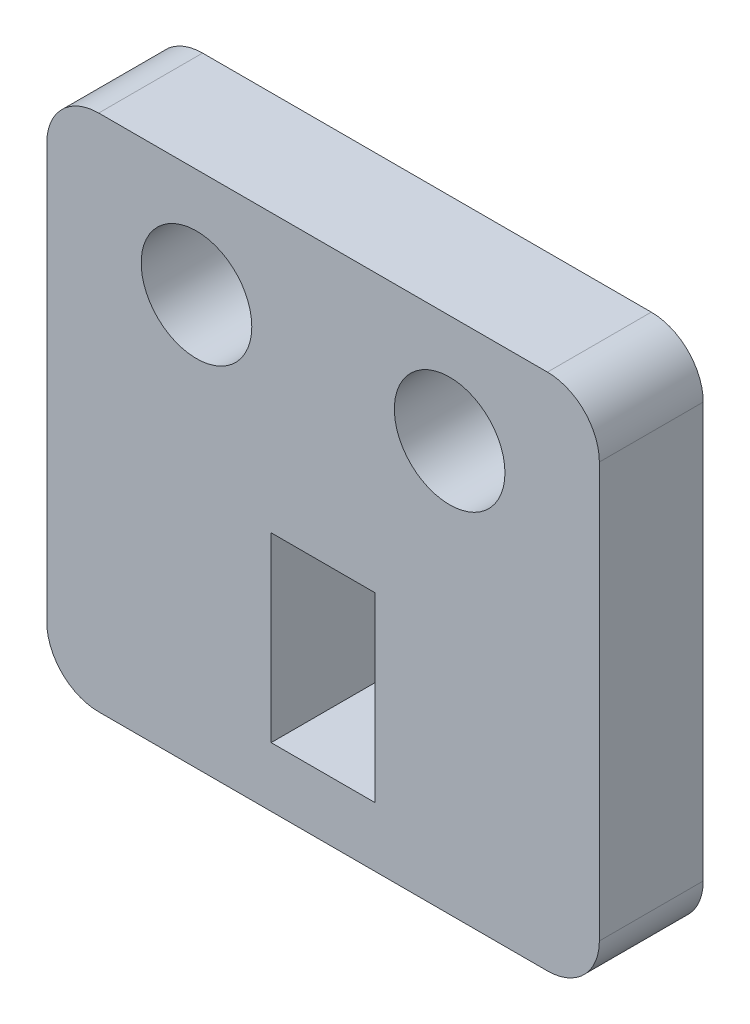
ISO-10303-21;
HEADER;
FILE_DESCRIPTION(('STEP AP214'),'2;1');
FILE_NAME('part.step','',(''),(''),'','','');
FILE_SCHEMA(('AUTOMOTIVE_DESIGN { 1 0 10303 214 1 1 1 1 }'));
ENDSEC;
DATA;
#1=APPLICATION_CONTEXT('core data for automotive mechanical design processes');
#2=APPLICATION_PROTOCOL_DEFINITION('international standard','automotive_design',2000,#1);
#3=PRODUCT_CONTEXT('',#1,'mechanical');
#4=PRODUCT('Part','Part','',(#3));
#5=PRODUCT_RELATED_PRODUCT_CATEGORY('part','',(#4));
#6=PRODUCT_DEFINITION_FORMATION('','',#4);
#7=PRODUCT_DEFINITION_CONTEXT('part definition',#1,'design');
#8=PRODUCT_DEFINITION('design','',#6,#7);
#9=PRODUCT_DEFINITION_SHAPE('','',#8);
#10=(LENGTH_UNIT() NAMED_UNIT(*) SI_UNIT(.MILLI.,.METRE.));
#11=(NAMED_UNIT(*) PLANE_ANGLE_UNIT() SI_UNIT($,.RADIAN.));
#12=(NAMED_UNIT(*) SI_UNIT($,.STERADIAN.) SOLID_ANGLE_UNIT());
#13=UNCERTAINTY_MEASURE_WITH_UNIT(LENGTH_MEASURE(1.E-05),#10,'distance_accuracy_value','');
#14=(GEOMETRIC_REPRESENTATION_CONTEXT(3) GLOBAL_UNCERTAINTY_ASSIGNED_CONTEXT((#13)) GLOBAL_UNIT_ASSIGNED_CONTEXT((#10,
#11,#12)) REPRESENTATION_CONTEXT('',''));
#15=CARTESIAN_POINT('',(0.,0.,0.));
#16=DIRECTION('',(0.,0.,1.));
#17=DIRECTION('',(1.,0.,0.));
#18=AXIS2_PLACEMENT_3D('',#15,#16,#17);
#19=CARTESIAN_POINT('',(0.,0.,4.));
#20=DIRECTION('',(0.,0.,-1.));
#21=DIRECTION('',(-1.,0.,0.));
#22=AXIS2_PLACEMENT_3D('',#19,#20,#21);
#23=PLANE('',#22);
#24=CARTESIAN_POINT('',(15.5159999244613,15.7941228703285,4.));
#25=DIRECTION('',(0.,0.,1.));
#26=DIRECTION('',(1.,0.,0.));
#27=AXIS2_PLACEMENT_3D('',#24,#25,#26);
#28=CIRCLE('',#27,2.13);
#29=CARTESIAN_POINT('',(17.6459999244613,15.7941228703285,4.));
#30=VERTEX_POINT('',#29);
#31=EDGE_CURVE('E171',#30,#30,#28,.T.);
#32=ORIENTED_EDGE('',*,*,#31,.F.);
#33=EDGE_LOOP('',(#32));
#34=FACE_BOUND('',#33,.T.);
#35=CARTESIAN_POINT('',(5.76599992446125,15.7941228703285,4.));
#36=DIRECTION('',(0.,0.,1.));
#37=DIRECTION('',(1.,0.,0.));
#38=AXIS2_PLACEMENT_3D('',#35,#36,#37);
#39=CIRCLE('',#38,2.13);
#40=CARTESIAN_POINT('',(7.89599992446125,15.7941228703285,4.));
#41=VERTEX_POINT('',#40);
#42=EDGE_CURVE('E177',#41,#41,#39,.T.);
#43=ORIENTED_EDGE('',*,*,#42,.F.);
#44=EDGE_LOOP('',(#43));
#45=FACE_BOUND('',#44,.T.);
#46=DIRECTION('',(-1.,0.,0.));
#47=VECTOR('',#46,1.);
#48=CARTESIAN_POINT('',(0.,19.9741228703285,4.));
#49=LINE('',#48,#47);
#50=CARTESIAN_POINT('',(19.2819998489225,19.9741228703285,4.));
#51=VERTEX_POINT('',#50);
#52=CARTESIAN_POINT('',(2.,19.9741228703285,4.));
#53=VERTEX_POINT('',#52);
#54=EDGE_CURVE('E191',#51,#53,#49,.T.);
#55=ORIENTED_EDGE('',*,*,#54,.T.);
#56=CARTESIAN_POINT('',(2.,17.9741228703285,4.));
#57=DIRECTION('',(0.,0.,-1.));
#58=DIRECTION('',(-1.,0.,0.));
#59=AXIS2_PLACEMENT_3D('',#56,#57,#58);
#60=CIRCLE('',#59,2.);
#61=CARTESIAN_POINT('',(0.,17.9741228703285,4.));
#62=VERTEX_POINT('',#61);
#63=EDGE_CURVE('E226',#53,#62,#60,.F.);
#64=ORIENTED_EDGE('',*,*,#63,.T.);
#65=DIRECTION('',(0.,-1.,0.));
#66=VECTOR('',#65,1.);
#67=CARTESIAN_POINT('',(0.,0.,4.));
#68=LINE('',#67,#66);
#69=CARTESIAN_POINT('',(0.,2.,4.));
#70=VERTEX_POINT('',#69);
#71=EDGE_CURVE('E183',#62,#70,#68,.T.);
#72=ORIENTED_EDGE('',*,*,#71,.T.);
#73=CARTESIAN_POINT('',(2.,2.,4.));
#74=DIRECTION('',(0.,0.,-1.));
#75=DIRECTION('',(-1.,0.,0.));
#76=AXIS2_PLACEMENT_3D('',#73,#74,#75);
#77=CIRCLE('',#76,2.);
#78=CARTESIAN_POINT('',(2.,0.,4.));
#79=VERTEX_POINT('',#78);
#80=EDGE_CURVE('E224',#70,#79,#77,.F.);
#81=ORIENTED_EDGE('',*,*,#80,.T.);
#82=DIRECTION('',(1.,0.,0.));
#83=VECTOR('',#82,1.);
#84=CARTESIAN_POINT('',(0.,0.,4.));
#85=LINE('',#84,#83);
#86=CARTESIAN_POINT('',(19.2819998489225,0.,4.));
#87=VERTEX_POINT('',#86);
#88=EDGE_CURVE('E186',#79,#87,#85,.T.);
#89=ORIENTED_EDGE('',*,*,#88,.T.);
#90=CARTESIAN_POINT('',(19.2819998489225,2.,4.));
#91=DIRECTION('',(0.,0.,-1.));
#92=DIRECTION('',(-1.,0.,0.));
#93=AXIS2_PLACEMENT_3D('',#90,#91,#92);
#94=CIRCLE('',#93,2.);
#95=CARTESIAN_POINT('',(21.2819998489225,2.,4.));
#96=VERTEX_POINT('',#95);
#97=EDGE_CURVE('E60',#87,#96,#94,.F.);
#98=ORIENTED_EDGE('',*,*,#97,.T.);
#99=DIRECTION('',(0.,1.,0.));
#100=VECTOR('',#99,1.);
#101=CARTESIAN_POINT('',(21.2819998489225,0.,4.));
#102=LINE('',#101,#100);
#103=CARTESIAN_POINT('',(21.2819998489225,17.9741228703285,4.));
#104=VERTEX_POINT('',#103);
#105=EDGE_CURVE('E189',#96,#104,#102,.T.);
#106=ORIENTED_EDGE('',*,*,#105,.T.);
#107=CARTESIAN_POINT('',(19.2819998489225,17.9741228703285,4.));
#108=DIRECTION('',(0.,0.,-1.));
#109=DIRECTION('',(-1.,0.,0.));
#110=AXIS2_PLACEMENT_3D('',#107,#108,#109);
#111=CIRCLE('',#110,2.);
#112=EDGE_CURVE('E221',#104,#51,#111,.F.);
#113=ORIENTED_EDGE('',*,*,#112,.T.);
#114=EDGE_LOOP('',(#55,#64,#72,#81,#89,#98,#106,#113));
#115=FACE_BOUND('',#114,.T.);
#116=DIRECTION('',(0.,1.,0.));
#117=VECTOR('',#116,1.);
#118=CARTESIAN_POINT('',(12.6409999244613,2.2941228703285,4.));
#119=LINE('',#118,#117);
#120=CARTESIAN_POINT('',(12.6409999244613,2.2941228703285,4.));
#121=VERTEX_POINT('',#120);
#122=CARTESIAN_POINT('',(12.6409999244613,9.2941228703285,4.));
#123=VERTEX_POINT('',#122);
#124=EDGE_CURVE('E130',#121,#123,#119,.T.);
#125=ORIENTED_EDGE('',*,*,#124,.F.);
#126=DIRECTION('',(1.,0.,0.));
#127=VECTOR('',#126,1.);
#128=CARTESIAN_POINT('',(8.64099992446125,2.2941228703285,4.));
#129=LINE('',#128,#127);
#130=CARTESIAN_POINT('',(8.64099992446125,2.2941228703285,4.));
#131=VERTEX_POINT('',#130);
#132=EDGE_CURVE('E155',#131,#121,#129,.T.);
#133=ORIENTED_EDGE('',*,*,#132,.F.);
#134=DIRECTION('',(0.,-1.,0.));
#135=VECTOR('',#134,1.);
#136=CARTESIAN_POINT('',(8.64099992446125,2.2941228703285,4.));
#137=LINE('',#136,#135);
#138=CARTESIAN_POINT('',(8.64099992446125,9.2941228703285,4.));
#139=VERTEX_POINT('',#138);
#140=EDGE_CURVE('E153',#139,#131,#137,.T.);
#141=ORIENTED_EDGE('',*,*,#140,.F.);
#142=DIRECTION('',(-1.,0.,0.));
#143=VECTOR('',#142,1.);
#144=CARTESIAN_POINT('',(8.64099992446125,9.2941228703285,4.));
#145=LINE('',#144,#143);
#146=EDGE_CURVE('E140',#123,#139,#145,.T.);
#147=ORIENTED_EDGE('',*,*,#146,.F.);
#148=EDGE_LOOP('',(#125,#133,#141,#147));
#149=FACE_BOUND('',#148,.T.);
#150=ADVANCED_FACE('F39',(#34,#45,#115,#149),#23,.F.);
#151=CARTESIAN_POINT('',(0.,0.,0.));
#152=DIRECTION('',(0.,0.,-1.));
#153=DIRECTION('',(-1.,0.,0.));
#154=AXIS2_PLACEMENT_3D('',#151,#152,#153);
#155=PLANE('',#154);
#156=CARTESIAN_POINT('',(5.76599992446125,15.7941228703285,0.));
#157=DIRECTION('',(0.,0.,1.));
#158=DIRECTION('',(1.,0.,0.));
#159=AXIS2_PLACEMENT_3D('',#156,#157,#158);
#160=CIRCLE('',#159,2.13);
#161=CARTESIAN_POINT('',(7.89599992446125,15.7941228703285,0.));
#162=VERTEX_POINT('',#161);
#163=EDGE_CURVE('E174',#162,#162,#160,.T.);
#164=ORIENTED_EDGE('',*,*,#163,.T.);
#165=EDGE_LOOP('',(#164));
#166=FACE_BOUND('',#165,.T.);
#167=DIRECTION('',(0.,-1.,0.));
#168=VECTOR('',#167,1.);
#169=CARTESIAN_POINT('',(0.,0.,0.));
#170=LINE('',#169,#168);
#171=CARTESIAN_POINT('',(0.,17.9741228703285,0.));
#172=VERTEX_POINT('',#171);
#173=CARTESIAN_POINT('',(0.,2.,0.));
#174=VERTEX_POINT('',#173);
#175=EDGE_CURVE('E180',#172,#174,#170,.T.);
#176=ORIENTED_EDGE('',*,*,#175,.F.);
#177=CARTESIAN_POINT('',(2.,17.9741228703285,0.));
#178=DIRECTION('',(0.,0.,-1.));
#179=DIRECTION('',(-1.,0.,0.));
#180=AXIS2_PLACEMENT_3D('',#177,#178,#179);
#181=CIRCLE('',#180,2.);
#182=CARTESIAN_POINT('',(2.,19.9741228703285,0.));
#183=VERTEX_POINT('',#182);
#184=EDGE_CURVE('E214',#172,#183,#181,.T.);
#185=ORIENTED_EDGE('',*,*,#184,.T.);
#186=DIRECTION('',(-1.,0.,0.));
#187=VECTOR('',#186,1.);
#188=CARTESIAN_POINT('',(0.,19.9741228703285,0.));
#189=LINE('',#188,#187);
#190=CARTESIAN_POINT('',(19.2819998489225,19.9741228703285,0.));
#191=VERTEX_POINT('',#190);
#192=EDGE_CURVE('E187',#191,#183,#189,.T.);
#193=ORIENTED_EDGE('',*,*,#192,.F.);
#194=CARTESIAN_POINT('',(19.2819998489225,17.9741228703285,0.));
#195=DIRECTION('',(0.,0.,-1.));
#196=DIRECTION('',(-1.,0.,0.));
#197=AXIS2_PLACEMENT_3D('',#194,#195,#196);
#198=CIRCLE('',#197,2.);
#199=CARTESIAN_POINT('',(21.2819998489225,17.9741228703285,0.));
#200=VERTEX_POINT('',#199);
#201=EDGE_CURVE('E208',#191,#200,#198,.T.);
#202=ORIENTED_EDGE('',*,*,#201,.T.);
#203=DIRECTION('',(0.,1.,0.));
#204=VECTOR('',#203,1.);
#205=CARTESIAN_POINT('',(21.2819998489225,0.,0.));
#206=LINE('',#205,#204);
#207=CARTESIAN_POINT('',(21.2819998489225,2.,0.));
#208=VERTEX_POINT('',#207);
#209=EDGE_CURVE('E200',#208,#200,#206,.T.);
#210=ORIENTED_EDGE('',*,*,#209,.F.);
#211=CARTESIAN_POINT('',(19.2819998489225,2.,0.));
#212=DIRECTION('',(0.,0.,-1.));
#213=DIRECTION('',(-1.,0.,0.));
#214=AXIS2_PLACEMENT_3D('',#211,#212,#213);
#215=CIRCLE('',#214,2.);
#216=CARTESIAN_POINT('',(19.2819998489225,0.,0.));
#217=VERTEX_POINT('',#216);
#218=EDGE_CURVE('E210',#208,#217,#215,.T.);
#219=ORIENTED_EDGE('',*,*,#218,.T.);
#220=DIRECTION('',(1.,0.,0.));
#221=VECTOR('',#220,1.);
#222=CARTESIAN_POINT('',(0.,0.,0.));
#223=LINE('',#222,#221);
#224=CARTESIAN_POINT('',(2.,0.,0.));
#225=VERTEX_POINT('',#224);
#226=EDGE_CURVE('E197',#225,#217,#223,.T.);
#227=ORIENTED_EDGE('',*,*,#226,.F.);
#228=CARTESIAN_POINT('',(2.,2.,0.));
#229=DIRECTION('',(0.,0.,-1.));
#230=DIRECTION('',(-1.,0.,0.));
#231=AXIS2_PLACEMENT_3D('',#228,#229,#230);
#232=CIRCLE('',#231,2.);
#233=EDGE_CURVE('E212',#225,#174,#232,.T.);
#234=ORIENTED_EDGE('',*,*,#233,.T.);
#235=EDGE_LOOP('',(#176,#185,#193,#202,#210,#219,#227,#234));
#236=FACE_BOUND('',#235,.T.);
#237=CARTESIAN_POINT('',(15.5159999244613,15.7941228703285,0.));
#238=DIRECTION('',(0.,0.,1.));
#239=DIRECTION('',(1.,0.,0.));
#240=AXIS2_PLACEMENT_3D('',#237,#238,#239);
#241=CIRCLE('',#240,2.13);
#242=CARTESIAN_POINT('',(17.6459999244613,15.7941228703285,0.));
#243=VERTEX_POINT('',#242);
#244=EDGE_CURVE('E148',#243,#243,#241,.T.);
#245=ORIENTED_EDGE('',*,*,#244,.T.);
#246=EDGE_LOOP('',(#245));
#247=FACE_BOUND('',#246,.T.);
#248=DIRECTION('',(1.,0.,0.));
#249=VECTOR('',#248,1.);
#250=CARTESIAN_POINT('',(8.64099992446125,2.2941228703285,0.));
#251=LINE('',#250,#249);
#252=CARTESIAN_POINT('',(8.64099992446125,2.2941228703285,0.));
#253=VERTEX_POINT('',#252);
#254=CARTESIAN_POINT('',(12.6409999244613,2.2941228703285,0.));
#255=VERTEX_POINT('',#254);
#256=EDGE_CURVE('E141',#253,#255,#251,.T.);
#257=ORIENTED_EDGE('',*,*,#256,.T.);
#258=DIRECTION('',(0.,1.,0.));
#259=VECTOR('',#258,1.);
#260=CARTESIAN_POINT('',(12.6409999244613,2.2941228703285,0.));
#261=LINE('',#260,#259);
#262=CARTESIAN_POINT('',(12.6409999244613,9.2941228703285,0.));
#263=VERTEX_POINT('',#262);
#264=EDGE_CURVE('E159',#255,#263,#261,.T.);
#265=ORIENTED_EDGE('',*,*,#264,.T.);
#266=DIRECTION('',(-1.,0.,0.));
#267=VECTOR('',#266,1.);
#268=CARTESIAN_POINT('',(8.64099992446125,9.2941228703285,0.));
#269=LINE('',#268,#267);
#270=CARTESIAN_POINT('',(8.64099992446125,9.2941228703285,0.));
#271=VERTEX_POINT('',#270);
#272=EDGE_CURVE('E147',#263,#271,#269,.T.);
#273=ORIENTED_EDGE('',*,*,#272,.T.);
#274=DIRECTION('',(0.,-1.,0.));
#275=VECTOR('',#274,1.);
#276=CARTESIAN_POINT('',(8.64099992446125,2.2941228703285,0.));
#277=LINE('',#276,#275);
#278=EDGE_CURVE('E162',#271,#253,#277,.T.);
#279=ORIENTED_EDGE('',*,*,#278,.T.);
#280=EDGE_LOOP('',(#257,#265,#273,#279));
#281=FACE_BOUND('',#280,.T.);
#282=ADVANCED_FACE('F242',(#166,#236,#247,#281),#155,.T.);
#283=CARTESIAN_POINT('',(0.,0.,4.));
#284=DIRECTION('',(1.,0.,0.));
#285=DIRECTION('',(0.,0.,-1.));
#286=AXIS2_PLACEMENT_3D('',#283,#284,#285);
#287=PLANE('',#286);
#288=ORIENTED_EDGE('',*,*,#71,.F.);
#289=DIRECTION('',(0.,0.,-1.));
#290=VECTOR('',#289,1.);
#291=CARTESIAN_POINT('',(0.,17.9741228703285,4.));
#292=LINE('',#291,#290);
#293=EDGE_CURVE('E205',#62,#172,#292,.T.);
#294=ORIENTED_EDGE('',*,*,#293,.T.);
#295=ORIENTED_EDGE('',*,*,#175,.T.);
#296=DIRECTION('',(0.,0.,-1.));
#297=VECTOR('',#296,1.);
#298=CARTESIAN_POINT('',(0.,2.,4.));
#299=LINE('',#298,#297);
#300=EDGE_CURVE('E194',#174,#70,#299,.F.);
#301=ORIENTED_EDGE('',*,*,#300,.T.);
#302=EDGE_LOOP('',(#288,#294,#295,#301));
#303=FACE_BOUND('',#302,.T.);
#304=ADVANCED_FACE('F263',(#303),#287,.F.);
#305=CARTESIAN_POINT('',(0.,0.,4.));
#306=DIRECTION('',(0.,1.,0.));
#307=DIRECTION('',(-1.,0.,0.));
#308=AXIS2_PLACEMENT_3D('',#305,#306,#307);
#309=PLANE('',#308);
#310=ORIENTED_EDGE('',*,*,#88,.F.);
#311=DIRECTION('',(0.,0.,-1.));
#312=VECTOR('',#311,1.);
#313=CARTESIAN_POINT('',(2.,0.,4.));
#314=LINE('',#313,#312);
#315=EDGE_CURVE('E230',#79,#225,#314,.T.);
#316=ORIENTED_EDGE('',*,*,#315,.T.);
#317=ORIENTED_EDGE('',*,*,#226,.T.);
#318=DIRECTION('',(0.,0.,-1.));
#319=VECTOR('',#318,1.);
#320=CARTESIAN_POINT('',(19.2819998489225,0.,4.));
#321=LINE('',#320,#319);
#322=EDGE_CURVE('E228',#217,#87,#321,.F.);
#323=ORIENTED_EDGE('',*,*,#322,.T.);
#324=EDGE_LOOP('',(#310,#316,#317,#323));
#325=FACE_BOUND('',#324,.T.);
#326=ADVANCED_FACE('F236',(#325),#309,.F.);
#327=CARTESIAN_POINT('',(21.2819998489225,0.,4.));
#328=DIRECTION('',(-1.,0.,0.));
#329=DIRECTION('',(0.,-1.,0.));
#330=AXIS2_PLACEMENT_3D('',#327,#328,#329);
#331=PLANE('',#330);
#332=ORIENTED_EDGE('',*,*,#105,.F.);
#333=DIRECTION('',(0.,0.,-1.));
#334=VECTOR('',#333,1.);
#335=CARTESIAN_POINT('',(21.2819998489225,2.,4.));
#336=LINE('',#335,#334);
#337=EDGE_CURVE('E11',#96,#208,#336,.T.);
#338=ORIENTED_EDGE('',*,*,#337,.T.);
#339=ORIENTED_EDGE('',*,*,#209,.T.);
#340=DIRECTION('',(0.,0.,-1.));
#341=VECTOR('',#340,1.);
#342=CARTESIAN_POINT('',(21.2819998489225,17.9741228703285,4.));
#343=LINE('',#342,#341);
#344=EDGE_CURVE('E47',#200,#104,#343,.F.);
#345=ORIENTED_EDGE('',*,*,#344,.T.);
#346=EDGE_LOOP('',(#332,#338,#339,#345));
#347=FACE_BOUND('',#346,.T.);
#348=ADVANCED_FACE('F248',(#347),#331,.F.);
#349=CARTESIAN_POINT('',(0.,19.9741228703285,4.));
#350=DIRECTION('',(0.,-1.,0.));
#351=DIRECTION('',(1.,0.,0.));
#352=AXIS2_PLACEMENT_3D('',#349,#350,#351);
#353=PLANE('',#352);
#354=ORIENTED_EDGE('',*,*,#192,.T.);
#355=DIRECTION('',(0.,0.,-1.));
#356=VECTOR('',#355,1.);
#357=CARTESIAN_POINT('',(2.,19.9741228703285,4.));
#358=LINE('',#357,#356);
#359=EDGE_CURVE('E219',#183,#53,#358,.F.);
#360=ORIENTED_EDGE('',*,*,#359,.T.);
#361=ORIENTED_EDGE('',*,*,#54,.F.);
#362=DIRECTION('',(0.,0.,-1.));
#363=VECTOR('',#362,1.);
#364=CARTESIAN_POINT('',(19.2819998489225,19.9741228703285,4.));
#365=LINE('',#364,#363);
#366=EDGE_CURVE('E216',#51,#191,#365,.T.);
#367=ORIENTED_EDGE('',*,*,#366,.T.);
#368=EDGE_LOOP('',(#354,#360,#361,#367));
#369=FACE_BOUND('',#368,.T.);
#370=ADVANCED_FACE('F255',(#369),#353,.F.);
#371=CARTESIAN_POINT('',(5.76599992446125,15.7941228703285,4.));
#372=DIRECTION('',(0.,0.,-1.));
#373=DIRECTION('',(-1.,0.,0.));
#374=AXIS2_PLACEMENT_3D('',#371,#372,#373);
#375=CYLINDRICAL_SURFACE('',#374,2.13);
#376=ORIENTED_EDGE('',*,*,#42,.T.);
#377=EDGE_LOOP('',(#376));
#378=FACE_BOUND('',#377,.T.);
#379=ORIENTED_EDGE('',*,*,#163,.F.);
#380=EDGE_LOOP('',(#379));
#381=FACE_BOUND('',#380,.T.);
#382=ADVANCED_FACE('F286',(#378,#381),#375,.F.);
#383=CARTESIAN_POINT('',(15.5159999244613,15.7941228703285,4.));
#384=DIRECTION('',(0.,0.,-1.));
#385=DIRECTION('',(-1.,0.,0.));
#386=AXIS2_PLACEMENT_3D('',#383,#384,#385);
#387=CYLINDRICAL_SURFACE('',#386,2.13);
#388=ORIENTED_EDGE('',*,*,#31,.T.);
#389=EDGE_LOOP('',(#388));
#390=FACE_BOUND('',#389,.T.);
#391=ORIENTED_EDGE('',*,*,#244,.F.);
#392=EDGE_LOOP('',(#391));
#393=FACE_BOUND('',#392,.T.);
#394=ADVANCED_FACE('F374',(#390,#393),#387,.F.);
#395=CARTESIAN_POINT('',(12.6409999244613,2.2941228703285,4.));
#396=DIRECTION('',(-1.,0.,0.));
#397=DIRECTION('',(0.,0.,1.));
#398=AXIS2_PLACEMENT_3D('',#395,#396,#397);
#399=PLANE('',#398);
#400=ORIENTED_EDGE('',*,*,#264,.F.);
#401=DIRECTION('',(0.,0.,-1.));
#402=VECTOR('',#401,1.);
#403=CARTESIAN_POINT('',(12.6409999244613,2.2941228703285,4.));
#404=LINE('',#403,#402);
#405=EDGE_CURVE('E136',#121,#255,#404,.T.);
#406=ORIENTED_EDGE('',*,*,#405,.F.);
#407=ORIENTED_EDGE('',*,*,#124,.T.);
#408=DIRECTION('',(0.,0.,-1.));
#409=VECTOR('',#408,1.);
#410=CARTESIAN_POINT('',(12.6409999244613,9.2941228703285,4.));
#411=LINE('',#410,#409);
#412=EDGE_CURVE('E133',#123,#263,#411,.T.);
#413=ORIENTED_EDGE('',*,*,#412,.T.);
#414=EDGE_LOOP('',(#400,#406,#407,#413));
#415=FACE_BOUND('',#414,.T.);
#416=ADVANCED_FACE('F132',(#415),#399,.T.);
#417=CARTESIAN_POINT('',(8.64099992446125,9.2941228703285,4.));
#418=DIRECTION('',(0.,-1.,0.));
#419=DIRECTION('',(0.,0.,-1.));
#420=AXIS2_PLACEMENT_3D('',#417,#418,#419);
#421=PLANE('',#420);
#422=ORIENTED_EDGE('',*,*,#272,.F.);
#423=ORIENTED_EDGE('',*,*,#412,.F.);
#424=ORIENTED_EDGE('',*,*,#146,.T.);
#425=DIRECTION('',(0.,0.,-1.));
#426=VECTOR('',#425,1.);
#427=CARTESIAN_POINT('',(8.64099992446125,9.2941228703285,4.));
#428=LINE('',#427,#426);
#429=EDGE_CURVE('E149',#139,#271,#428,.T.);
#430=ORIENTED_EDGE('',*,*,#429,.T.);
#431=EDGE_LOOP('',(#422,#423,#424,#430));
#432=FACE_BOUND('',#431,.T.);
#433=ADVANCED_FACE('F144',(#432),#421,.T.);
#434=CARTESIAN_POINT('',(8.64099992446125,2.2941228703285,4.));
#435=DIRECTION('',(1.,0.,0.));
#436=DIRECTION('',(0.,0.,-1.));
#437=AXIS2_PLACEMENT_3D('',#434,#435,#436);
#438=PLANE('',#437);
#439=ORIENTED_EDGE('',*,*,#278,.F.);
#440=ORIENTED_EDGE('',*,*,#429,.F.);
#441=ORIENTED_EDGE('',*,*,#140,.T.);
#442=DIRECTION('',(0.,0.,-1.));
#443=VECTOR('',#442,1.);
#444=CARTESIAN_POINT('',(8.64099992446125,2.2941228703285,4.));
#445=LINE('',#444,#443);
#446=EDGE_CURVE('E168',#131,#253,#445,.T.);
#447=ORIENTED_EDGE('',*,*,#446,.T.);
#448=EDGE_LOOP('',(#439,#440,#441,#447));
#449=FACE_BOUND('',#448,.T.);
#450=ADVANCED_FACE('F347',(#449),#438,.T.);
#451=CARTESIAN_POINT('',(8.64099992446125,2.2941228703285,4.));
#452=DIRECTION('',(0.,1.,0.));
#453=DIRECTION('',(0.,0.,1.));
#454=AXIS2_PLACEMENT_3D('',#451,#452,#453);
#455=PLANE('',#454);
#456=ORIENTED_EDGE('',*,*,#256,.F.);
#457=ORIENTED_EDGE('',*,*,#446,.F.);
#458=ORIENTED_EDGE('',*,*,#132,.T.);
#459=ORIENTED_EDGE('',*,*,#405,.T.);
#460=EDGE_LOOP('',(#456,#457,#458,#459));
#461=FACE_BOUND('',#460,.T.);
#462=ADVANCED_FACE('F272',(#461),#455,.T.);
#463=CARTESIAN_POINT('',(2.,17.9741228703285,4.));
#464=DIRECTION('',(0.,0.,-1.));
#465=DIRECTION('',(-1.,0.,0.));
#466=AXIS2_PLACEMENT_3D('',#463,#464,#465);
#467=CYLINDRICAL_SURFACE('',#466,2.);
#468=ORIENTED_EDGE('',*,*,#63,.F.);
#469=ORIENTED_EDGE('',*,*,#359,.F.);
#470=ORIENTED_EDGE('',*,*,#184,.F.);
#471=ORIENTED_EDGE('',*,*,#293,.F.);
#472=EDGE_LOOP('',(#468,#469,#470,#471));
#473=FACE_BOUND('',#472,.T.);
#474=ADVANCED_FACE('F260',(#473),#467,.T.);
#475=CARTESIAN_POINT('',(2.,2.,4.));
#476=DIRECTION('',(0.,0.,-1.));
#477=DIRECTION('',(-1.,0.,0.));
#478=AXIS2_PLACEMENT_3D('',#475,#476,#477);
#479=CYLINDRICAL_SURFACE('',#478,2.);
#480=ORIENTED_EDGE('',*,*,#80,.F.);
#481=ORIENTED_EDGE('',*,*,#300,.F.);
#482=ORIENTED_EDGE('',*,*,#233,.F.);
#483=ORIENTED_EDGE('',*,*,#315,.F.);
#484=EDGE_LOOP('',(#480,#481,#482,#483));
#485=FACE_BOUND('',#484,.T.);
#486=ADVANCED_FACE('F265',(#485),#479,.T.);
#487=CARTESIAN_POINT('',(19.2819998489225,2.,4.));
#488=DIRECTION('',(0.,0.,-1.));
#489=DIRECTION('',(-1.,0.,0.));
#490=AXIS2_PLACEMENT_3D('',#487,#488,#489);
#491=CYLINDRICAL_SURFACE('',#490,2.);
#492=ORIENTED_EDGE('',*,*,#97,.F.);
#493=ORIENTED_EDGE('',*,*,#322,.F.);
#494=ORIENTED_EDGE('',*,*,#218,.F.);
#495=ORIENTED_EDGE('',*,*,#337,.F.);
#496=EDGE_LOOP('',(#492,#493,#494,#495));
#497=FACE_BOUND('',#496,.T.);
#498=ADVANCED_FACE('F247',(#497),#491,.T.);
#499=CARTESIAN_POINT('',(19.2819998489225,17.9741228703285,4.));
#500=DIRECTION('',(0.,0.,-1.));
#501=DIRECTION('',(-1.,0.,0.));
#502=AXIS2_PLACEMENT_3D('',#499,#500,#501);
#503=CYLINDRICAL_SURFACE('',#502,2.);
#504=ORIENTED_EDGE('',*,*,#112,.F.);
#505=ORIENTED_EDGE('',*,*,#344,.F.);
#506=ORIENTED_EDGE('',*,*,#201,.F.);
#507=ORIENTED_EDGE('',*,*,#366,.F.);
#508=EDGE_LOOP('',(#504,#505,#506,#507));
#509=FACE_BOUND('',#508,.T.);
#510=ADVANCED_FACE('F41',(#509),#503,.T.);
#511=CLOSED_SHELL('',(#150,#282,#304,#326,#348,#370,#382,#394,#416,#433,#450,#462,#474,#486,
#498,#510));
#512=MANIFOLD_SOLID_BREP('B2',#511);
#513=ADVANCED_BREP_SHAPE_REPRESENTATION('',(#18,#512),#14);
#514=SHAPE_DEFINITION_REPRESENTATION(#9,#513);
ENDSEC;
END-ISO-10303-21;
